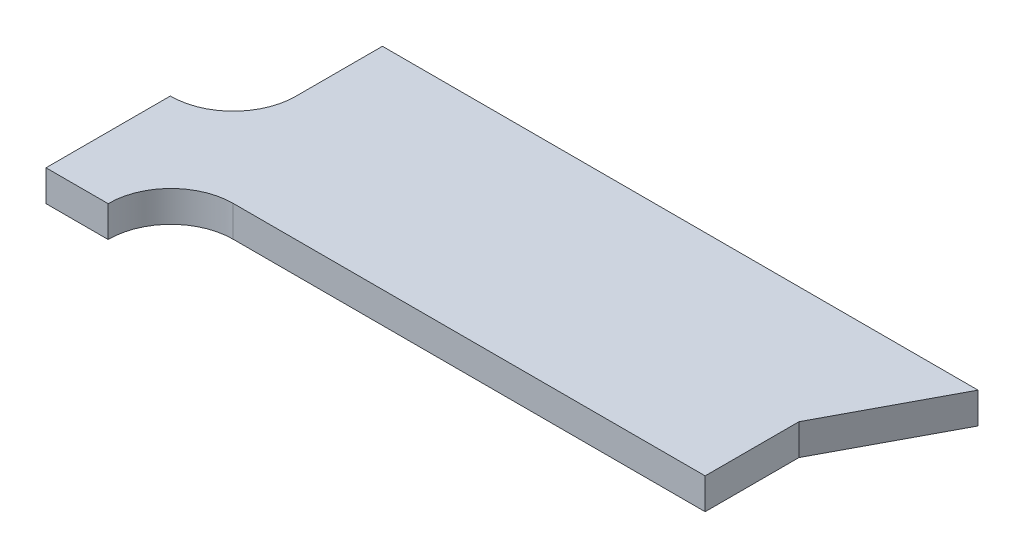
ISO-10303-21;
HEADER;
FILE_DESCRIPTION(('STEP AP214'),'2;1');
FILE_NAME('part.step','',(''),(''),'','','');
FILE_SCHEMA(('AUTOMOTIVE_DESIGN { 1 0 10303 214 1 1 1 1 }'));
ENDSEC;
DATA;
#1=APPLICATION_CONTEXT('core data for automotive mechanical design processes');
#2=APPLICATION_PROTOCOL_DEFINITION('international standard','automotive_design',2000,#1);
#3=PRODUCT_CONTEXT('',#1,'mechanical');
#4=PRODUCT('Part','Part','',(#3));
#5=PRODUCT_RELATED_PRODUCT_CATEGORY('part','',(#4));
#6=PRODUCT_DEFINITION_FORMATION('','',#4);
#7=PRODUCT_DEFINITION_CONTEXT('part definition',#1,'design');
#8=PRODUCT_DEFINITION('design','',#6,#7);
#9=PRODUCT_DEFINITION_SHAPE('','',#8);
#10=(LENGTH_UNIT() NAMED_UNIT(*) SI_UNIT(.MILLI.,.METRE.));
#11=(NAMED_UNIT(*) PLANE_ANGLE_UNIT() SI_UNIT($,.RADIAN.));
#12=(NAMED_UNIT(*) SI_UNIT($,.STERADIAN.) SOLID_ANGLE_UNIT());
#13=UNCERTAINTY_MEASURE_WITH_UNIT(LENGTH_MEASURE(1.E-05),#10,'distance_accuracy_value','');
#14=(GEOMETRIC_REPRESENTATION_CONTEXT(3) GLOBAL_UNCERTAINTY_ASSIGNED_CONTEXT((#13)) GLOBAL_UNIT_ASSIGNED_CONTEXT((#10,
#11,#12)) REPRESENTATION_CONTEXT('',''));
#15=CARTESIAN_POINT('',(0.,0.,0.));
#16=DIRECTION('',(0.,0.,1.));
#17=DIRECTION('',(1.,0.,0.));
#18=AXIS2_PLACEMENT_3D('',#15,#16,#17);
#19=CARTESIAN_POINT('',(0.,0.25,0.));
#20=DIRECTION('',(1.,0.,0.));
#21=DIRECTION('',(0.,0.,-1.));
#22=AXIS2_PLACEMENT_3D('',#19,#20,#21);
#23=PLANE('',#22);
#24=DIRECTION('',(0.,0.,1.));
#25=VECTOR('',#24,1.);
#26=CARTESIAN_POINT('',(0.,0.,0.));
#27=LINE('',#26,#25);
#28=CARTESIAN_POINT('',(0.,0.,-1.00000000000007));
#29=VERTEX_POINT('',#28);
#30=CARTESIAN_POINT('',(0.,0.,0.));
#31=VERTEX_POINT('',#30);
#32=EDGE_CURVE('E150',#29,#31,#27,.T.);
#33=ORIENTED_EDGE('',*,*,#32,.T.);
#34=DIRECTION('',(0.,-1.,0.));
#35=VECTOR('',#34,1.);
#36=CARTESIAN_POINT('',(0.,0.25,0.));
#37=LINE('',#36,#35);
#38=CARTESIAN_POINT('',(0.,0.25,0.));
#39=VERTEX_POINT('',#38);
#40=EDGE_CURVE('E11',#39,#31,#37,.T.);
#41=ORIENTED_EDGE('',*,*,#40,.F.);
#42=DIRECTION('',(0.,0.,1.));
#43=VECTOR('',#42,1.);
#44=CARTESIAN_POINT('',(0.,0.25,0.));
#45=LINE('',#44,#43);
#46=CARTESIAN_POINT('',(0.,0.25,-1.00000000000007));
#47=VERTEX_POINT('',#46);
#48=EDGE_CURVE('E175',#47,#39,#45,.T.);
#49=ORIENTED_EDGE('',*,*,#48,.F.);
#50=DIRECTION('',(0.,-1.,0.));
#51=VECTOR('',#50,1.);
#52=CARTESIAN_POINT('',(0.,0.25,-1.00000000000007));
#53=LINE('',#52,#51);
#54=EDGE_CURVE('E146',#47,#29,#53,.T.);
#55=ORIENTED_EDGE('',*,*,#54,.T.);
#56=EDGE_LOOP('',(#33,#41,#49,#55));
#57=FACE_BOUND('',#56,.T.);
#58=ADVANCED_FACE('F43',(#57),#23,.F.);
#59=CARTESIAN_POINT('',(0.,0.25,0.));
#60=DIRECTION('',(0.,0.,-1.));
#61=DIRECTION('',(-1.,0.,0.));
#62=AXIS2_PLACEMENT_3D('',#59,#60,#61);
#63=PLANE('',#62);
#64=DIRECTION('',(1.,0.,0.));
#65=VECTOR('',#64,1.);
#66=CARTESIAN_POINT('',(0.,0.,0.));
#67=LINE('',#66,#65);
#68=CARTESIAN_POINT('',(0.5,0.,0.));
#69=VERTEX_POINT('',#68);
#70=EDGE_CURVE('E154',#31,#69,#67,.T.);
#71=ORIENTED_EDGE('',*,*,#70,.T.);
#72=DIRECTION('',(0.,-1.,0.));
#73=VECTOR('',#72,1.);
#74=CARTESIAN_POINT('',(0.5,0.25,0.));
#75=LINE('',#74,#73);
#76=CARTESIAN_POINT('',(0.5,0.25,0.));
#77=VERTEX_POINT('',#76);
#78=EDGE_CURVE('E52',#77,#69,#75,.T.);
#79=ORIENTED_EDGE('',*,*,#78,.F.);
#80=DIRECTION('',(1.,0.,0.));
#81=VECTOR('',#80,1.);
#82=CARTESIAN_POINT('',(0.,0.25,0.));
#83=LINE('',#82,#81);
#84=EDGE_CURVE('E106',#39,#77,#83,.T.);
#85=ORIENTED_EDGE('',*,*,#84,.F.);
#86=ORIENTED_EDGE('',*,*,#40,.T.);
#87=EDGE_LOOP('',(#71,#79,#85,#86));
#88=FACE_BOUND('',#87,.T.);
#89=ADVANCED_FACE('F231',(#88),#63,.F.);
#90=CARTESIAN_POINT('',(0.999975871600174,0.25,-0.00491200749661155));
#91=DIRECTION('',(0.,-1.,0.));
#92=DIRECTION('',(0.,0.,-1.));
#93=AXIS2_PLACEMENT_3D('',#90,#91,#92);
#94=CYLINDRICAL_SURFACE('',#93,0.5);
#95=CARTESIAN_POINT('',(0.999975871600174,0.,-0.00491200749661155));
#96=DIRECTION('',(0.,-1.,0.));
#97=DIRECTION('',(0.,0.,-1.));
#98=AXIS2_PLACEMENT_3D('',#95,#96,#97);
#99=CIRCLE('',#98,0.5);
#100=CARTESIAN_POINT('',(0.999975871600174,0.,-0.504912007496612));
#101=VERTEX_POINT('',#100);
#102=EDGE_CURVE('E157',#69,#101,#99,.T.);
#103=ORIENTED_EDGE('',*,*,#102,.T.);
#104=DIRECTION('',(0.,-1.,0.));
#105=VECTOR('',#104,1.);
#106=CARTESIAN_POINT('',(0.999975871600174,0.25,-0.504912007496612));
#107=LINE('',#106,#105);
#108=CARTESIAN_POINT('',(0.999975871600174,0.25,-0.504912007496612));
#109=VERTEX_POINT('',#108);
#110=EDGE_CURVE('E190',#109,#101,#107,.T.);
#111=ORIENTED_EDGE('',*,*,#110,.F.);
#112=CARTESIAN_POINT('',(0.999975871600174,0.25,-0.00491200749661155));
#113=DIRECTION('',(0.,-1.,0.));
#114=DIRECTION('',(0.,0.,-1.));
#115=AXIS2_PLACEMENT_3D('',#112,#113,#114);
#116=CIRCLE('',#115,0.5);
#117=EDGE_CURVE('E200',#77,#109,#116,.T.);
#118=ORIENTED_EDGE('',*,*,#117,.F.);
#119=ORIENTED_EDGE('',*,*,#78,.T.);
#120=EDGE_LOOP('',(#103,#111,#118,#119));
#121=FACE_BOUND('',#120,.T.);
#122=ADVANCED_FACE('F198',(#121),#94,.F.);
#123=CARTESIAN_POINT('',(0.999975871600174,0.25,-0.504912007496612));
#124=DIRECTION('',(0.,0.,-1.));
#125=DIRECTION('',(-1.,0.,0.));
#126=AXIS2_PLACEMENT_3D('',#123,#124,#125);
#127=PLANE('',#126);
#128=DIRECTION('',(1.,0.,0.));
#129=VECTOR('',#128,1.);
#130=CARTESIAN_POINT('',(0.999975871600174,0.,-0.504912007496612));
#131=LINE('',#130,#129);
#132=CARTESIAN_POINT('',(4.79806774068559,0.,-0.504912007496612));
#133=VERTEX_POINT('',#132);
#134=EDGE_CURVE('E160',#101,#133,#131,.T.);
#135=ORIENTED_EDGE('',*,*,#134,.T.);
#136=DIRECTION('',(0.,-1.,0.));
#137=VECTOR('',#136,1.);
#138=CARTESIAN_POINT('',(4.79806774068559,0.25,-0.504912007496612));
#139=LINE('',#138,#137);
#140=CARTESIAN_POINT('',(4.79806774068559,0.25,-0.504912007496612));
#141=VERTEX_POINT('',#140);
#142=EDGE_CURVE('E186',#141,#133,#139,.T.);
#143=ORIENTED_EDGE('',*,*,#142,.F.);
#144=DIRECTION('',(1.,0.,0.));
#145=VECTOR('',#144,1.);
#146=CARTESIAN_POINT('',(0.999975871600174,0.25,-0.504912007496612));
#147=LINE('',#146,#145);
#148=EDGE_CURVE('E217',#109,#141,#147,.T.);
#149=ORIENTED_EDGE('',*,*,#148,.F.);
#150=ORIENTED_EDGE('',*,*,#110,.T.);
#151=EDGE_LOOP('',(#135,#143,#149,#150));
#152=FACE_BOUND('',#151,.T.);
#153=ADVANCED_FACE('F209',(#152),#127,.F.);
#154=CARTESIAN_POINT('',(4.79806774068559,0.25,-0.504912007496612));
#155=DIRECTION('',(-1.,0.,0.));
#156=DIRECTION('',(0.,0.,1.));
#157=AXIS2_PLACEMENT_3D('',#154,#155,#156);
#158=PLANE('',#157);
#159=DIRECTION('',(0.,0.,-1.));
#160=VECTOR('',#159,1.);
#161=CARTESIAN_POINT('',(4.79806774068559,0.,-0.504912007496612));
#162=LINE('',#161,#160);
#163=CARTESIAN_POINT('',(4.79806774068559,0.,-1.25963676732685));
#164=VERTEX_POINT('',#163);
#165=EDGE_CURVE('E163',#133,#164,#162,.T.);
#166=ORIENTED_EDGE('',*,*,#165,.T.);
#167=DIRECTION('',(0.,-1.,0.));
#168=VECTOR('',#167,1.);
#169=CARTESIAN_POINT('',(4.79806774068559,0.25,-1.25963676732685));
#170=LINE('',#169,#168);
#171=CARTESIAN_POINT('',(4.79806774068559,0.25,-1.25963676732685));
#172=VERTEX_POINT('',#171);
#173=EDGE_CURVE('E182',#172,#164,#170,.T.);
#174=ORIENTED_EDGE('',*,*,#173,.F.);
#175=DIRECTION('',(0.,0.,-1.));
#176=VECTOR('',#175,1.);
#177=CARTESIAN_POINT('',(4.79806774068559,0.25,-0.504912007496612));
#178=LINE('',#177,#176);
#179=EDGE_CURVE('E215',#141,#172,#178,.T.);
#180=ORIENTED_EDGE('',*,*,#179,.F.);
#181=ORIENTED_EDGE('',*,*,#142,.T.);
#182=EDGE_LOOP('',(#166,#174,#180,#181));
#183=FACE_BOUND('',#182,.T.);
#184=ADVANCED_FACE('F213',(#183),#158,.F.);
#185=CARTESIAN_POINT('',(5.29806774068559,0.25,-2.2));
#186=DIRECTION('',(-0.882947592858925,0.,-0.469471562785895));
#187=DIRECTION('',(-0.469471562785895,0.,0.882947592858925));
#188=AXIS2_PLACEMENT_3D('',#185,#186,#187);
#189=PLANE('',#188);
#190=DIRECTION('',(0.469471562785895,0.,-0.882947592858925));
#191=VECTOR('',#190,1.);
#192=CARTESIAN_POINT('',(5.29806774068559,0.,-2.2));
#193=LINE('',#192,#191);
#194=CARTESIAN_POINT('',(5.29806774068559,0.,-2.2));
#195=VERTEX_POINT('',#194);
#196=EDGE_CURVE('E166',#164,#195,#193,.T.);
#197=ORIENTED_EDGE('',*,*,#196,.T.);
#198=DIRECTION('',(0.,-1.,0.));
#199=VECTOR('',#198,1.);
#200=CARTESIAN_POINT('',(5.29806774068559,0.25,-2.2));
#201=LINE('',#200,#199);
#202=CARTESIAN_POINT('',(5.29806774068559,0.25,-2.2));
#203=VERTEX_POINT('',#202);
#204=EDGE_CURVE('E139',#203,#195,#201,.T.);
#205=ORIENTED_EDGE('',*,*,#204,.F.);
#206=DIRECTION('',(0.469471562785895,0.,-0.882947592858925));
#207=VECTOR('',#206,1.);
#208=CARTESIAN_POINT('',(5.29806774068559,0.25,-2.2));
#209=LINE('',#208,#207);
#210=EDGE_CURVE('E128',#172,#203,#209,.T.);
#211=ORIENTED_EDGE('',*,*,#210,.F.);
#212=ORIENTED_EDGE('',*,*,#173,.T.);
#213=EDGE_LOOP('',(#197,#205,#211,#212));
#214=FACE_BOUND('',#213,.T.);
#215=ADVANCED_FACE('F243',(#214),#189,.F.);
#216=CARTESIAN_POINT('',(0.506730751237118,0.25,-2.2));
#217=DIRECTION('',(0.,0.,1.));
#218=DIRECTION('',(1.,0.,0.));
#219=AXIS2_PLACEMENT_3D('',#216,#217,#218);
#220=PLANE('',#219);
#221=DIRECTION('',(-1.,0.,0.));
#222=VECTOR('',#221,1.);
#223=CARTESIAN_POINT('',(0.506730751237118,0.,-2.2));
#224=LINE('',#223,#222);
#225=CARTESIAN_POINT('',(0.506730751237118,0.,-2.2));
#226=VERTEX_POINT('',#225);
#227=EDGE_CURVE('E137',#195,#226,#224,.T.);
#228=ORIENTED_EDGE('',*,*,#227,.T.);
#229=DIRECTION('',(0.,-1.,0.));
#230=VECTOR('',#229,1.);
#231=CARTESIAN_POINT('',(0.506730751237118,0.25,-2.2));
#232=LINE('',#231,#230);
#233=CARTESIAN_POINT('',(0.506730751237118,0.25,-2.2));
#234=VERTEX_POINT('',#233);
#235=EDGE_CURVE('E134',#234,#226,#232,.T.);
#236=ORIENTED_EDGE('',*,*,#235,.F.);
#237=DIRECTION('',(-1.,0.,0.));
#238=VECTOR('',#237,1.);
#239=CARTESIAN_POINT('',(0.506730751237118,0.25,-2.2));
#240=LINE('',#239,#238);
#241=EDGE_CURVE('E122',#203,#234,#240,.T.);
#242=ORIENTED_EDGE('',*,*,#241,.F.);
#243=ORIENTED_EDGE('',*,*,#204,.T.);
#244=EDGE_LOOP('',(#228,#236,#242,#243));
#245=FACE_BOUND('',#244,.T.);
#246=ADVANCED_FACE('F135',(#245),#220,.F.);
#247=CARTESIAN_POINT('',(0.506730751237118,0.25,-1.50335976932817));
#248=DIRECTION('',(1.,0.,0.));
#249=DIRECTION('',(0.,0.,-1.));
#250=AXIS2_PLACEMENT_3D('',#247,#248,#249);
#251=PLANE('',#250);
#252=DIRECTION('',(0.,0.,1.));
#253=VECTOR('',#252,1.);
#254=CARTESIAN_POINT('',(0.506730751237118,0.,-1.50335976932817));
#255=LINE('',#254,#253);
#256=CARTESIAN_POINT('',(0.506730751237118,0.,-1.50335976932817));
#257=VERTEX_POINT('',#256);
#258=EDGE_CURVE('E92',#226,#257,#255,.T.);
#259=ORIENTED_EDGE('',*,*,#258,.T.);
#260=DIRECTION('',(0.,-1.,0.));
#261=VECTOR('',#260,1.);
#262=CARTESIAN_POINT('',(0.506730751237118,0.25,-1.50335976932817));
#263=LINE('',#262,#261);
#264=CARTESIAN_POINT('',(0.506730751237118,0.25,-1.50335976932817));
#265=VERTEX_POINT('',#264);
#266=EDGE_CURVE('E140',#265,#257,#263,.T.);
#267=ORIENTED_EDGE('',*,*,#266,.F.);
#268=DIRECTION('',(0.,0.,1.));
#269=VECTOR('',#268,1.);
#270=CARTESIAN_POINT('',(0.506730751237118,0.25,-1.50335976932817));
#271=LINE('',#270,#269);
#272=EDGE_CURVE('E126',#234,#265,#271,.T.);
#273=ORIENTED_EDGE('',*,*,#272,.F.);
#274=ORIENTED_EDGE('',*,*,#235,.T.);
#275=EDGE_LOOP('',(#259,#267,#273,#274));
#276=FACE_BOUND('',#275,.T.);
#277=ADVANCED_FACE('F142',(#276),#251,.F.);
#278=CARTESIAN_POINT('',(0.00335976932817086,0.25,-1.50335976932817));
#279=DIRECTION('',(0.,-1.,0.));
#280=DIRECTION('',(0.,0.,-1.));
#281=AXIS2_PLACEMENT_3D('',#278,#279,#280);
#282=CYLINDRICAL_SURFACE('',#281,0.503370981908947);
#283=CARTESIAN_POINT('',(0.00335976932817086,0.,-1.50335976932817));
#284=DIRECTION('',(0.,-1.,0.));
#285=DIRECTION('',(0.,0.,1.));
#286=AXIS2_PLACEMENT_3D('',#283,#284,#285);
#287=CIRCLE('',#286,0.503370981908947);
#288=EDGE_CURVE('E98',#257,#29,#287,.T.);
#289=ORIENTED_EDGE('',*,*,#288,.T.);
#290=ORIENTED_EDGE('',*,*,#54,.F.);
#291=CARTESIAN_POINT('',(0.00335976932817086,0.25,-1.50335976932817));
#292=DIRECTION('',(0.,-1.,0.));
#293=DIRECTION('',(0.,0.,1.));
#294=AXIS2_PLACEMENT_3D('',#291,#292,#293);
#295=CIRCLE('',#294,0.503370981908947);
#296=EDGE_CURVE('E60',#265,#47,#295,.T.);
#297=ORIENTED_EDGE('',*,*,#296,.F.);
#298=ORIENTED_EDGE('',*,*,#266,.T.);
#299=EDGE_LOOP('',(#289,#290,#297,#298));
#300=FACE_BOUND('',#299,.T.);
#301=ADVANCED_FACE('F251',(#300),#282,.F.);
#302=CARTESIAN_POINT('',(0.00335976932817086,0.25,-1.50335976932817));
#303=DIRECTION('',(0.,1.,0.));
#304=DIRECTION('',(0.,0.,1.));
#305=AXIS2_PLACEMENT_3D('',#302,#303,#304);
#306=PLANE('',#305);
#307=ORIENTED_EDGE('',*,*,#48,.T.);
#308=ORIENTED_EDGE('',*,*,#84,.T.);
#309=ORIENTED_EDGE('',*,*,#117,.T.);
#310=ORIENTED_EDGE('',*,*,#148,.T.);
#311=ORIENTED_EDGE('',*,*,#179,.T.);
#312=ORIENTED_EDGE('',*,*,#210,.T.);
#313=ORIENTED_EDGE('',*,*,#241,.T.);
#314=ORIENTED_EDGE('',*,*,#272,.T.);
#315=ORIENTED_EDGE('',*,*,#296,.T.);
#316=EDGE_LOOP('',(#307,#308,#309,#310,#311,#312,#313,#314,#315));
#317=FACE_BOUND('',#316,.T.);
#318=ADVANCED_FACE('F124',(#317),#306,.T.);
#319=CARTESIAN_POINT('',(0.00335976932817086,0.,-1.50335976932817));
#320=DIRECTION('',(0.,1.,0.));
#321=DIRECTION('',(0.,0.,1.));
#322=AXIS2_PLACEMENT_3D('',#319,#320,#321);
#323=PLANE('',#322);
#324=ORIENTED_EDGE('',*,*,#32,.F.);
#325=ORIENTED_EDGE('',*,*,#288,.F.);
#326=ORIENTED_EDGE('',*,*,#258,.F.);
#327=ORIENTED_EDGE('',*,*,#227,.F.);
#328=ORIENTED_EDGE('',*,*,#196,.F.);
#329=ORIENTED_EDGE('',*,*,#165,.F.);
#330=ORIENTED_EDGE('',*,*,#134,.F.);
#331=ORIENTED_EDGE('',*,*,#102,.F.);
#332=ORIENTED_EDGE('',*,*,#70,.F.);
#333=EDGE_LOOP('',(#324,#325,#326,#327,#328,#329,#330,#331,#332));
#334=FACE_BOUND('',#333,.T.);
#335=ADVANCED_FACE('F204',(#334),#323,.F.);
#336=CLOSED_SHELL('',(#58,#89,#122,#153,#184,#215,#246,#277,#301,#318,#335));
#337=MANIFOLD_SOLID_BREP('B2',#336);
#338=ADVANCED_BREP_SHAPE_REPRESENTATION('',(#18,#337),#14);
#339=SHAPE_DEFINITION_REPRESENTATION(#9,#338);
ENDSEC;
END-ISO-10303-21;
